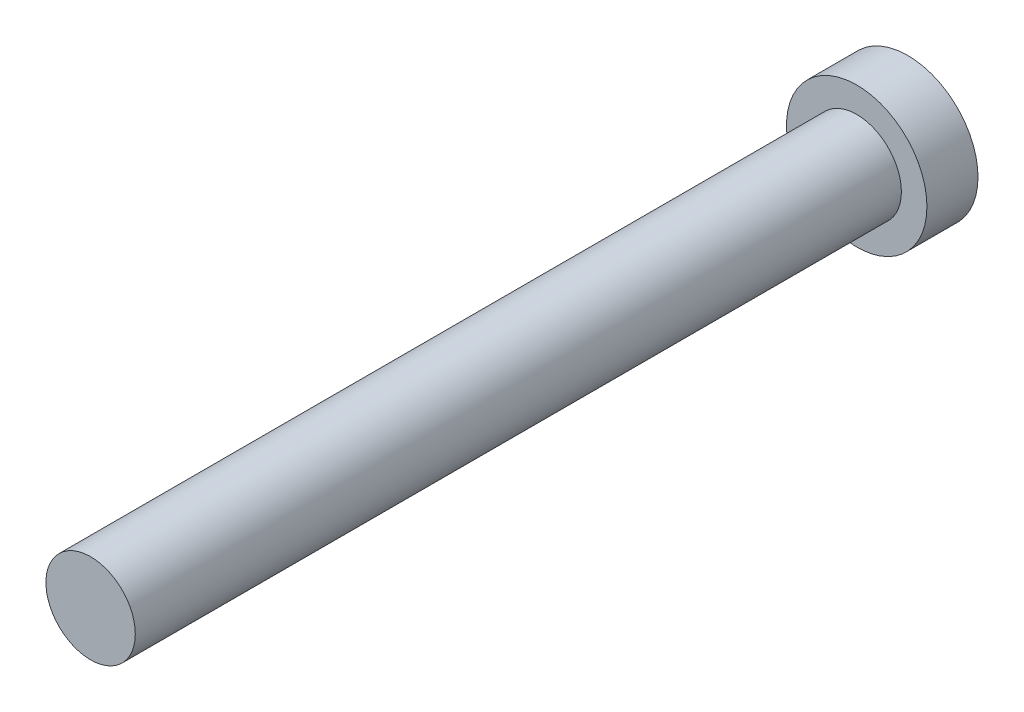
ISO-10303-21;
HEADER;
FILE_DESCRIPTION(('STEP AP214'),'2;1');
FILE_NAME('part.step','',(''),(''),'','','');
FILE_SCHEMA(('AUTOMOTIVE_DESIGN { 1 0 10303 214 1 1 1 1 }'));
ENDSEC;
DATA;
#1=APPLICATION_CONTEXT('core data for automotive mechanical design processes');
#2=APPLICATION_PROTOCOL_DEFINITION('international standard','automotive_design',2000,#1);
#3=PRODUCT_CONTEXT('',#1,'mechanical');
#4=PRODUCT('Part','Part','',(#3));
#5=PRODUCT_RELATED_PRODUCT_CATEGORY('part','',(#4));
#6=PRODUCT_DEFINITION_FORMATION('','',#4);
#7=PRODUCT_DEFINITION_CONTEXT('part definition',#1,'design');
#8=PRODUCT_DEFINITION('design','',#6,#7);
#9=PRODUCT_DEFINITION_SHAPE('','',#8);
#10=(LENGTH_UNIT() NAMED_UNIT(*) SI_UNIT(.MILLI.,.METRE.));
#11=(NAMED_UNIT(*) PLANE_ANGLE_UNIT() SI_UNIT($,.RADIAN.));
#12=(NAMED_UNIT(*) SI_UNIT($,.STERADIAN.) SOLID_ANGLE_UNIT());
#13=UNCERTAINTY_MEASURE_WITH_UNIT(LENGTH_MEASURE(1.E-05),#10,'distance_accuracy_value','');
#14=(GEOMETRIC_REPRESENTATION_CONTEXT(3) GLOBAL_UNCERTAINTY_ASSIGNED_CONTEXT((#13)) GLOBAL_UNIT_ASSIGNED_CONTEXT((#10,
#11,#12)) REPRESENTATION_CONTEXT('',''));
#15=CARTESIAN_POINT('',(0.,0.,0.));
#16=DIRECTION('',(0.,0.,1.));
#17=DIRECTION('',(1.,0.,0.));
#18=AXIS2_PLACEMENT_3D('',#15,#16,#17);
#19=CARTESIAN_POINT('',(0.,0.,2.));
#20=DIRECTION('',(0.,0.,1.));
#21=DIRECTION('',(1.,0.,0.));
#22=AXIS2_PLACEMENT_3D('',#19,#20,#21);
#23=PLANE('',#22);
#24=CARTESIAN_POINT('',(0.,0.,2.));
#25=DIRECTION('',(0.,0.,1.));
#26=DIRECTION('',(1.,0.,0.));
#27=AXIS2_PLACEMENT_3D('',#24,#25,#26);
#28=CIRCLE('',#27,2.75);
#29=CARTESIAN_POINT('',(2.75,0.,2.));
#30=VERTEX_POINT('',#29);
#31=EDGE_CURVE('E10',#30,#30,#28,.T.);
#32=ORIENTED_EDGE('',*,*,#31,.T.);
#33=EDGE_LOOP('',(#32));
#34=FACE_BOUND('',#33,.T.);
#35=CARTESIAN_POINT('',(0.,0.,2.));
#36=DIRECTION('',(0.,0.,1.));
#37=DIRECTION('',(1.,0.,0.));
#38=AXIS2_PLACEMENT_3D('',#35,#36,#37);
#39=CIRCLE('',#38,1.75);
#40=CARTESIAN_POINT('',(1.75,0.,2.));
#41=VERTEX_POINT('',#40);
#42=EDGE_CURVE('E42',#41,#41,#39,.T.);
#43=ORIENTED_EDGE('',*,*,#42,.F.);
#44=EDGE_LOOP('',(#43));
#45=FACE_BOUND('',#44,.T.);
#46=ADVANCED_FACE('F29',(#34,#45),#23,.T.);
#47=CARTESIAN_POINT('',(0.,0.,2.));
#48=DIRECTION('',(0.,0.,-1.));
#49=DIRECTION('',(-1.,0.,0.));
#50=AXIS2_PLACEMENT_3D('',#47,#48,#49);
#51=CYLINDRICAL_SURFACE('',#50,2.75);
#52=ORIENTED_EDGE('',*,*,#31,.F.);
#53=EDGE_LOOP('',(#52));
#54=FACE_BOUND('',#53,.T.);
#55=CARTESIAN_POINT('',(0.,0.,0.));
#56=DIRECTION('',(0.,0.,1.));
#57=DIRECTION('',(1.,0.,0.));
#58=AXIS2_PLACEMENT_3D('',#55,#56,#57);
#59=CIRCLE('',#58,2.75);
#60=CARTESIAN_POINT('',(2.75,0.,0.));
#61=VERTEX_POINT('',#60);
#62=EDGE_CURVE('E33',#61,#61,#59,.T.);
#63=ORIENTED_EDGE('',*,*,#62,.T.);
#64=EDGE_LOOP('',(#63));
#65=FACE_BOUND('',#64,.T.);
#66=ADVANCED_FACE('F31',(#54,#65),#51,.T.);
#67=CARTESIAN_POINT('',(0.,0.,0.));
#68=DIRECTION('',(0.,0.,1.));
#69=DIRECTION('',(1.,0.,0.));
#70=AXIS2_PLACEMENT_3D('',#67,#68,#69);
#71=PLANE('',#70);
#72=ORIENTED_EDGE('',*,*,#62,.F.);
#73=EDGE_LOOP('',(#72));
#74=FACE_BOUND('',#73,.T.);
#75=ADVANCED_FACE('F53',(#74),#71,.F.);
#76=CARTESIAN_POINT('',(0.,0.,32.));
#77=DIRECTION('',(0.,0.,-1.));
#78=DIRECTION('',(-1.,0.,0.));
#79=AXIS2_PLACEMENT_3D('',#76,#77,#78);
#80=CYLINDRICAL_SURFACE('',#79,1.75);
#81=CARTESIAN_POINT('',(0.,0.,32.));
#82=DIRECTION('',(0.,0.,1.));
#83=DIRECTION('',(1.,0.,0.));
#84=AXIS2_PLACEMENT_3D('',#81,#82,#83);
#85=CIRCLE('',#84,1.75);
#86=CARTESIAN_POINT('',(1.75,0.,32.));
#87=VERTEX_POINT('',#86);
#88=EDGE_CURVE('E40',#87,#87,#85,.T.);
#89=ORIENTED_EDGE('',*,*,#88,.F.);
#90=EDGE_LOOP('',(#89));
#91=FACE_BOUND('',#90,.T.);
#92=ORIENTED_EDGE('',*,*,#42,.T.);
#93=EDGE_LOOP('',(#92));
#94=FACE_BOUND('',#93,.T.);
#95=ADVANCED_FACE('F50',(#91,#94),#80,.T.);
#96=CARTESIAN_POINT('',(0.,0.,32.));
#97=DIRECTION('',(0.,0.,1.));
#98=DIRECTION('',(1.,0.,0.));
#99=AXIS2_PLACEMENT_3D('',#96,#97,#98);
#100=PLANE('',#99);
#101=ORIENTED_EDGE('',*,*,#88,.T.);
#102=EDGE_LOOP('',(#101));
#103=FACE_BOUND('',#102,.T.);
#104=ADVANCED_FACE('F48',(#103),#100,.T.);
#105=CLOSED_SHELL('',(#46,#66,#75,#95,#104));
#106=MANIFOLD_SOLID_BREP('B2',#105);
#107=ADVANCED_BREP_SHAPE_REPRESENTATION('',(#18,#106),#14);
#108=SHAPE_DEFINITION_REPRESENTATION(#9,#107);
ENDSEC;
END-ISO-10303-21;
